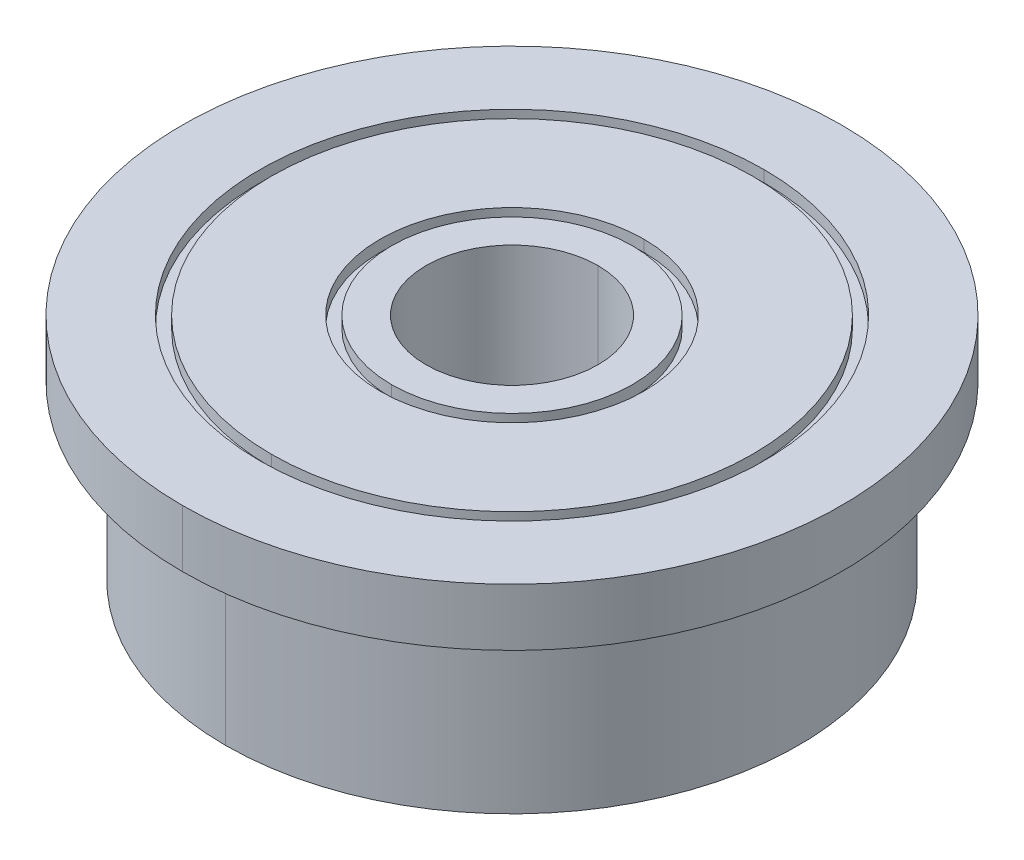
ISO-10303-21;
HEADER;
FILE_DESCRIPTION(('STEP AP214'),'2;1');
FILE_NAME('part.step','',(''),(''),'','','');
FILE_SCHEMA(('AUTOMOTIVE_DESIGN { 1 0 10303 214 1 1 1 1 }'));
ENDSEC;
DATA;
#1=APPLICATION_CONTEXT('core data for automotive mechanical design processes');
#2=APPLICATION_PROTOCOL_DEFINITION('international standard','automotive_design',2000,#1);
#3=PRODUCT_CONTEXT('',#1,'mechanical');
#4=PRODUCT('Part','Part','',(#3));
#5=PRODUCT_RELATED_PRODUCT_CATEGORY('part','',(#4));
#6=PRODUCT_DEFINITION_FORMATION('','',#4);
#7=PRODUCT_DEFINITION_CONTEXT('part definition',#1,'design');
#8=PRODUCT_DEFINITION('design','',#6,#7);
#9=PRODUCT_DEFINITION_SHAPE('','',#8);
#10=(LENGTH_UNIT() NAMED_UNIT(*) SI_UNIT(.MILLI.,.METRE.));
#11=(NAMED_UNIT(*) PLANE_ANGLE_UNIT() SI_UNIT($,.RADIAN.));
#12=(NAMED_UNIT(*) SI_UNIT($,.STERADIAN.) SOLID_ANGLE_UNIT());
#13=UNCERTAINTY_MEASURE_WITH_UNIT(LENGTH_MEASURE(1.E-05),#10,'distance_accuracy_value','');
#14=(GEOMETRIC_REPRESENTATION_CONTEXT(3) GLOBAL_UNCERTAINTY_ASSIGNED_CONTEXT((#13)) GLOBAL_UNIT_ASSIGNED_CONTEXT((#10,
#11,#12)) REPRESENTATION_CONTEXT('',''));
#15=CARTESIAN_POINT('',(0.,0.,0.));
#16=DIRECTION('',(0.,0.,1.));
#17=DIRECTION('',(1.,0.,0.));
#18=AXIS2_PLACEMENT_3D('',#15,#16,#17);
#19=CARTESIAN_POINT('',(0.,3.99999999999999,-5.75));
#20=DIRECTION('',(0.,1.,0.));
#21=DIRECTION('',(0.,0.,1.));
#22=AXIS2_PLACEMENT_3D('',#19,#20,#21);
#23=PLANE('',#22);
#24=CARTESIAN_POINT('',(0.,4.,0.));
#25=DIRECTION('',(0.,-1.,0.));
#26=DIRECTION('',(0.,0.,-1.));
#27=AXIS2_PLACEMENT_3D('',#24,#25,#26);
#28=CIRCLE('',#27,2.1);
#29=CARTESIAN_POINT('',(0.,4.,-2.1));
#30=VERTEX_POINT('',#29);
#31=CARTESIAN_POINT('',(0.,4.,2.1));
#32=VERTEX_POINT('',#31);
#33=EDGE_CURVE('E20',#30,#32,#28,.T.);
#34=ORIENTED_EDGE('',*,*,#33,.F.);
#35=CARTESIAN_POINT('',(0.,4.,0.));
#36=DIRECTION('',(0.,-1.,0.));
#37=DIRECTION('',(0.,0.,-1.));
#38=AXIS2_PLACEMENT_3D('',#35,#36,#37);
#39=CIRCLE('',#38,2.1);
#40=EDGE_CURVE('E171',#32,#30,#39,.T.);
#41=ORIENTED_EDGE('',*,*,#40,.F.);
#42=EDGE_LOOP('',(#34,#41));
#43=FACE_BOUND('',#42,.T.);
#44=CARTESIAN_POINT('',(0.,3.99999999999999,0.));
#45=DIRECTION('',(0.,1.,0.));
#46=DIRECTION('',(0.,0.,1.));
#47=AXIS2_PLACEMENT_3D('',#44,#45,#46);
#48=CIRCLE('',#47,1.5);
#49=CARTESIAN_POINT('',(0.,3.99999999999999,1.5));
#50=VERTEX_POINT('',#49);
#51=CARTESIAN_POINT('',(0.,3.99999999999999,-1.5));
#52=VERTEX_POINT('',#51);
#53=EDGE_CURVE('E299',#50,#52,#48,.F.);
#54=ORIENTED_EDGE('',*,*,#53,.T.);
#55=CARTESIAN_POINT('',(0.,3.99999999999999,0.));
#56=DIRECTION('',(0.,1.,0.));
#57=DIRECTION('',(0.,0.,1.));
#58=AXIS2_PLACEMENT_3D('',#55,#56,#57);
#59=CIRCLE('',#58,1.5);
#60=EDGE_CURVE('E302',#52,#50,#59,.F.);
#61=ORIENTED_EDGE('',*,*,#60,.T.);
#62=EDGE_LOOP('',(#54,#61));
#63=FACE_BOUND('',#62,.T.);
#64=ADVANCED_FACE('F17',(#43,#63),#23,.T.);
#65=CARTESIAN_POINT('',(0.,0.,0.));
#66=DIRECTION('',(0.,-1.,0.));
#67=DIRECTION('',(0.,0.,-1.));
#68=AXIS2_PLACEMENT_3D('',#65,#66,#67);
#69=CYLINDRICAL_SURFACE('',#68,2.1);
#70=CARTESIAN_POINT('',(0.,3.8,0.));
#71=DIRECTION('',(0.,-1.,0.));
#72=DIRECTION('',(0.,0.,-1.));
#73=AXIS2_PLACEMENT_3D('',#70,#71,#72);
#74=CIRCLE('',#73,2.1);
#75=CARTESIAN_POINT('',(0.,3.8,2.1));
#76=VERTEX_POINT('',#75);
#77=CARTESIAN_POINT('',(0.,3.8,-2.1));
#78=VERTEX_POINT('',#77);
#79=EDGE_CURVE('E296',#76,#78,#74,.F.);
#80=ORIENTED_EDGE('',*,*,#79,.T.);
#81=DIRECTION('',(0.,-1.,0.));
#82=VECTOR('',#81,1.);
#83=CARTESIAN_POINT('',(0.,0.,-2.1));
#84=LINE('',#83,#82);
#85=EDGE_CURVE('E169',#30,#78,#84,.T.);
#86=ORIENTED_EDGE('',*,*,#85,.F.);
#87=ORIENTED_EDGE('',*,*,#33,.T.);
#88=DIRECTION('',(0.,-1.,0.));
#89=VECTOR('',#88,1.);
#90=CARTESIAN_POINT('',(0.,0.,2.1));
#91=LINE('',#90,#89);
#92=EDGE_CURVE('E166',#76,#32,#91,.F.);
#93=ORIENTED_EDGE('',*,*,#92,.F.);
#94=EDGE_LOOP('',(#80,#86,#87,#93));
#95=FACE_BOUND('',#94,.T.);
#96=ADVANCED_FACE('F164',(#95),#69,.T.);
#97=CARTESIAN_POINT('',(0.,0.,0.));
#98=DIRECTION('',(0.,-1.,0.));
#99=DIRECTION('',(0.,0.,-1.));
#100=AXIS2_PLACEMENT_3D('',#97,#98,#99);
#101=CYLINDRICAL_SURFACE('',#100,2.1);
#102=ORIENTED_EDGE('',*,*,#85,.T.);
#103=CARTESIAN_POINT('',(0.,3.8,0.));
#104=DIRECTION('',(0.,-1.,0.));
#105=DIRECTION('',(0.,0.,-1.));
#106=AXIS2_PLACEMENT_3D('',#103,#104,#105);
#107=CIRCLE('',#106,2.1);
#108=EDGE_CURVE('E176',#78,#76,#107,.F.);
#109=ORIENTED_EDGE('',*,*,#108,.T.);
#110=ORIENTED_EDGE('',*,*,#92,.T.);
#111=ORIENTED_EDGE('',*,*,#40,.T.);
#112=EDGE_LOOP('',(#102,#109,#110,#111));
#113=FACE_BOUND('',#112,.T.);
#114=ADVANCED_FACE('F174',(#113),#101,.T.);
#115=CARTESIAN_POINT('',(0.,0.,0.));
#116=DIRECTION('',(0.,1.,0.));
#117=DIRECTION('',(0.,0.,1.));
#118=AXIS2_PLACEMENT_3D('',#115,#116,#117);
#119=CYLINDRICAL_SURFACE('',#118,1.5);
#120=CARTESIAN_POINT('',(0.,0.,0.));
#121=DIRECTION('',(0.,1.,0.));
#122=DIRECTION('',(0.,0.,1.));
#123=AXIS2_PLACEMENT_3D('',#120,#121,#122);
#124=CIRCLE('',#123,1.5);
#125=CARTESIAN_POINT('',(0.,0.,1.5));
#126=VERTEX_POINT('',#125);
#127=CARTESIAN_POINT('',(0.,0.,-1.5));
#128=VERTEX_POINT('',#127);
#129=EDGE_CURVE('E292',#126,#128,#124,.T.);
#130=ORIENTED_EDGE('',*,*,#129,.F.);
#131=DIRECTION('',(0.,1.,0.));
#132=VECTOR('',#131,1.);
#133=CARTESIAN_POINT('',(0.,0.,1.5));
#134=LINE('',#133,#132);
#135=EDGE_CURVE('E301',#126,#50,#134,.T.);
#136=ORIENTED_EDGE('',*,*,#135,.T.);
#137=ORIENTED_EDGE('',*,*,#60,.F.);
#138=DIRECTION('',(0.,1.,0.));
#139=VECTOR('',#138,1.);
#140=CARTESIAN_POINT('',(0.,0.,-1.5));
#141=LINE('',#140,#139);
#142=EDGE_CURVE('E298',#52,#128,#141,.F.);
#143=ORIENTED_EDGE('',*,*,#142,.T.);
#144=EDGE_LOOP('',(#130,#136,#137,#143));
#145=FACE_BOUND('',#144,.T.);
#146=ADVANCED_FACE('F320',(#145),#119,.F.);
#147=CARTESIAN_POINT('',(0.,0.,0.));
#148=DIRECTION('',(0.,1.,0.));
#149=DIRECTION('',(0.,0.,1.));
#150=AXIS2_PLACEMENT_3D('',#147,#148,#149);
#151=CYLINDRICAL_SURFACE('',#150,1.5);
#152=ORIENTED_EDGE('',*,*,#142,.F.);
#153=ORIENTED_EDGE('',*,*,#53,.F.);
#154=ORIENTED_EDGE('',*,*,#135,.F.);
#155=CARTESIAN_POINT('',(0.,0.,0.));
#156=DIRECTION('',(0.,1.,0.));
#157=DIRECTION('',(0.,0.,1.));
#158=AXIS2_PLACEMENT_3D('',#155,#156,#157);
#159=CIRCLE('',#158,1.5);
#160=EDGE_CURVE('E289',#128,#126,#159,.T.);
#161=ORIENTED_EDGE('',*,*,#160,.F.);
#162=EDGE_LOOP('',(#152,#153,#154,#161));
#163=FACE_BOUND('',#162,.T.);
#164=ADVANCED_FACE('F309',(#163),#151,.F.);
#165=CARTESIAN_POINT('',(0.,3.8,-2.1));
#166=DIRECTION('',(0.,-1.,0.));
#167=DIRECTION('',(0.,0.,-1.));
#168=AXIS2_PLACEMENT_3D('',#165,#166,#167);
#169=PLANE('',#168);
#170=CARTESIAN_POINT('',(0.,3.8,0.));
#171=DIRECTION('',(0.,-1.,0.));
#172=DIRECTION('',(0.,0.,-1.));
#173=AXIS2_PLACEMENT_3D('',#170,#171,#172);
#174=CIRCLE('',#173,2.3);
#175=CARTESIAN_POINT('',(0.,3.8,2.3));
#176=VERTEX_POINT('',#175);
#177=CARTESIAN_POINT('',(0.,3.8,-2.3));
#178=VERTEX_POINT('',#177);
#179=EDGE_CURVE('E287',#176,#178,#174,.F.);
#180=ORIENTED_EDGE('',*,*,#179,.T.);
#181=CARTESIAN_POINT('',(0.,3.8,0.));
#182=DIRECTION('',(0.,-1.,0.));
#183=DIRECTION('',(0.,0.,-1.));
#184=AXIS2_PLACEMENT_3D('',#181,#182,#183);
#185=CIRCLE('',#184,2.3);
#186=EDGE_CURVE('E284',#178,#176,#185,.F.);
#187=ORIENTED_EDGE('',*,*,#186,.T.);
#188=EDGE_LOOP('',(#180,#187));
#189=FACE_BOUND('',#188,.T.);
#190=ORIENTED_EDGE('',*,*,#79,.F.);
#191=ORIENTED_EDGE('',*,*,#108,.F.);
#192=EDGE_LOOP('',(#190,#191));
#193=FACE_BOUND('',#192,.T.);
#194=ADVANCED_FACE('F306',(#189,#193),#169,.F.);
#195=CARTESIAN_POINT('',(0.,0.,0.));
#196=DIRECTION('',(0.,-1.,0.));
#197=DIRECTION('',(0.,0.,-1.));
#198=AXIS2_PLACEMENT_3D('',#195,#196,#197);
#199=PLANE('',#198);
#200=CARTESIAN_POINT('',(0.,0.,0.));
#201=DIRECTION('',(0.,-1.,0.));
#202=DIRECTION('',(0.,0.,-1.));
#203=AXIS2_PLACEMENT_3D('',#200,#201,#202);
#204=CIRCLE('',#203,2.1);
#205=CARTESIAN_POINT('',(0.,0.,-2.1));
#206=VERTEX_POINT('',#205);
#207=CARTESIAN_POINT('',(0.,0.,2.1));
#208=VERTEX_POINT('',#207);
#209=EDGE_CURVE('E281',#206,#208,#204,.F.);
#210=ORIENTED_EDGE('',*,*,#209,.F.);
#211=CARTESIAN_POINT('',(0.,0.,0.));
#212=DIRECTION('',(0.,-1.,0.));
#213=DIRECTION('',(0.,0.,-1.));
#214=AXIS2_PLACEMENT_3D('',#211,#212,#213);
#215=CIRCLE('',#214,2.1);
#216=EDGE_CURVE('E277',#208,#206,#215,.F.);
#217=ORIENTED_EDGE('',*,*,#216,.F.);
#218=EDGE_LOOP('',(#210,#217));
#219=FACE_BOUND('',#218,.T.);
#220=ORIENTED_EDGE('',*,*,#129,.T.);
#221=ORIENTED_EDGE('',*,*,#160,.T.);
#222=EDGE_LOOP('',(#220,#221));
#223=FACE_BOUND('',#222,.T.);
#224=ADVANCED_FACE('F308',(#219,#223),#199,.T.);
#225=CARTESIAN_POINT('',(0.,0.,0.));
#226=DIRECTION('',(0.,-1.,0.));
#227=DIRECTION('',(0.,0.,-1.));
#228=AXIS2_PLACEMENT_3D('',#225,#226,#227);
#229=CYLINDRICAL_SURFACE('',#228,2.3);
#230=CARTESIAN_POINT('',(0.,4.,0.));
#231=DIRECTION('',(0.,-1.,0.));
#232=DIRECTION('',(0.,0.,-1.));
#233=AXIS2_PLACEMENT_3D('',#230,#231,#232);
#234=CIRCLE('',#233,2.3);
#235=CARTESIAN_POINT('',(0.,4.,-2.3));
#236=VERTEX_POINT('',#235);
#237=CARTESIAN_POINT('',(0.,4.,2.3));
#238=VERTEX_POINT('',#237);
#239=EDGE_CURVE('E273',#236,#238,#234,.T.);
#240=ORIENTED_EDGE('',*,*,#239,.F.);
#241=DIRECTION('',(0.,-1.,0.));
#242=VECTOR('',#241,1.);
#243=CARTESIAN_POINT('',(0.,0.,-2.3));
#244=LINE('',#243,#242);
#245=EDGE_CURVE('E286',#236,#178,#244,.T.);
#246=ORIENTED_EDGE('',*,*,#245,.T.);
#247=ORIENTED_EDGE('',*,*,#179,.F.);
#248=DIRECTION('',(0.,-1.,0.));
#249=VECTOR('',#248,1.);
#250=CARTESIAN_POINT('',(0.,0.,2.3));
#251=LINE('',#250,#249);
#252=EDGE_CURVE('E283',#176,#238,#251,.F.);
#253=ORIENTED_EDGE('',*,*,#252,.T.);
#254=EDGE_LOOP('',(#240,#246,#247,#253));
#255=FACE_BOUND('',#254,.T.);
#256=ADVANCED_FACE('F317',(#255),#229,.F.);
#257=CARTESIAN_POINT('',(0.,0.,0.));
#258=DIRECTION('',(0.,-1.,0.));
#259=DIRECTION('',(0.,0.,-1.));
#260=AXIS2_PLACEMENT_3D('',#257,#258,#259);
#261=CYLINDRICAL_SURFACE('',#260,2.3);
#262=ORIENTED_EDGE('',*,*,#252,.F.);
#263=ORIENTED_EDGE('',*,*,#186,.F.);
#264=ORIENTED_EDGE('',*,*,#245,.F.);
#265=CARTESIAN_POINT('',(0.,4.,0.));
#266=DIRECTION('',(0.,-1.,0.));
#267=DIRECTION('',(0.,0.,-1.));
#268=AXIS2_PLACEMENT_3D('',#265,#266,#267);
#269=CIRCLE('',#268,2.3);
#270=EDGE_CURVE('E270',#238,#236,#269,.T.);
#271=ORIENTED_EDGE('',*,*,#270,.F.);
#272=EDGE_LOOP('',(#262,#263,#264,#271));
#273=FACE_BOUND('',#272,.T.);
#274=ADVANCED_FACE('F421',(#273),#261,.F.);
#275=CARTESIAN_POINT('',(0.,0.,0.));
#276=DIRECTION('',(0.,-1.,0.));
#277=DIRECTION('',(0.,0.,-1.));
#278=AXIS2_PLACEMENT_3D('',#275,#276,#277);
#279=CYLINDRICAL_SURFACE('',#278,2.1);
#280=DIRECTION('',(0.,-1.,0.));
#281=VECTOR('',#280,1.);
#282=CARTESIAN_POINT('',(0.,0.,-2.1));
#283=LINE('',#282,#281);
#284=CARTESIAN_POINT('',(0.,0.2,-2.1));
#285=VERTEX_POINT('',#284);
#286=EDGE_CURVE('E276',#206,#285,#283,.F.);
#287=ORIENTED_EDGE('',*,*,#286,.F.);
#288=ORIENTED_EDGE('',*,*,#209,.T.);
#289=DIRECTION('',(0.,-1.,0.));
#290=VECTOR('',#289,1.);
#291=CARTESIAN_POINT('',(0.,0.,2.1));
#292=LINE('',#291,#290);
#293=CARTESIAN_POINT('',(0.,0.2,2.1));
#294=VERTEX_POINT('',#293);
#295=EDGE_CURVE('E280',#294,#208,#292,.T.);
#296=ORIENTED_EDGE('',*,*,#295,.F.);
#297=CARTESIAN_POINT('',(0.,0.2,0.));
#298=DIRECTION('',(0.,-1.,0.));
#299=DIRECTION('',(0.,0.,-1.));
#300=AXIS2_PLACEMENT_3D('',#297,#298,#299);
#301=CIRCLE('',#300,2.1);
#302=EDGE_CURVE('E268',#294,#285,#301,.T.);
#303=ORIENTED_EDGE('',*,*,#302,.T.);
#304=EDGE_LOOP('',(#287,#288,#296,#303));
#305=FACE_BOUND('',#304,.T.);
#306=ADVANCED_FACE('F417',(#305),#279,.T.);
#307=CARTESIAN_POINT('',(0.,0.,0.));
#308=DIRECTION('',(0.,-1.,0.));
#309=DIRECTION('',(0.,0.,-1.));
#310=AXIS2_PLACEMENT_3D('',#307,#308,#309);
#311=CYLINDRICAL_SURFACE('',#310,2.1);
#312=ORIENTED_EDGE('',*,*,#216,.T.);
#313=ORIENTED_EDGE('',*,*,#286,.T.);
#314=CARTESIAN_POINT('',(0.,0.2,0.));
#315=DIRECTION('',(0.,-1.,0.));
#316=DIRECTION('',(0.,0.,-1.));
#317=AXIS2_PLACEMENT_3D('',#314,#315,#316);
#318=CIRCLE('',#317,2.1);
#319=EDGE_CURVE('E265',#285,#294,#318,.T.);
#320=ORIENTED_EDGE('',*,*,#319,.T.);
#321=ORIENTED_EDGE('',*,*,#295,.T.);
#322=EDGE_LOOP('',(#312,#313,#320,#321));
#323=FACE_BOUND('',#322,.T.);
#324=ADVANCED_FACE('F413',(#323),#311,.T.);
#325=CARTESIAN_POINT('',(0.,3.99999999999999,-5.75));
#326=DIRECTION('',(0.,1.,0.));
#327=DIRECTION('',(0.,0.,1.));
#328=AXIS2_PLACEMENT_3D('',#325,#326,#327);
#329=PLANE('',#328);
#330=CARTESIAN_POINT('',(0.,4.,0.));
#331=DIRECTION('',(0.,-1.,0.));
#332=DIRECTION('',(0.,0.,-1.));
#333=AXIS2_PLACEMENT_3D('',#330,#331,#332);
#334=CIRCLE('',#333,4.2);
#335=CARTESIAN_POINT('',(0.,4.,-4.2));
#336=VERTEX_POINT('',#335);
#337=CARTESIAN_POINT('',(0.,4.,4.2));
#338=VERTEX_POINT('',#337);
#339=EDGE_CURVE('E263',#336,#338,#334,.T.);
#340=ORIENTED_EDGE('',*,*,#339,.F.);
#341=CARTESIAN_POINT('',(0.,4.,0.));
#342=DIRECTION('',(0.,-1.,0.));
#343=DIRECTION('',(0.,0.,-1.));
#344=AXIS2_PLACEMENT_3D('',#341,#342,#343);
#345=CIRCLE('',#344,4.2);
#346=EDGE_CURVE('E259',#338,#336,#345,.T.);
#347=ORIENTED_EDGE('',*,*,#346,.F.);
#348=EDGE_LOOP('',(#340,#347));
#349=FACE_BOUND('',#348,.T.);
#350=ORIENTED_EDGE('',*,*,#239,.T.);
#351=ORIENTED_EDGE('',*,*,#270,.T.);
#352=EDGE_LOOP('',(#350,#351));
#353=FACE_BOUND('',#352,.T.);
#354=ADVANCED_FACE('F409',(#349,#353),#329,.T.);
#355=CARTESIAN_POINT('',(0.,0.2,-2.1));
#356=DIRECTION('',(0.,1.,0.));
#357=DIRECTION('',(0.,0.,1.));
#358=AXIS2_PLACEMENT_3D('',#355,#356,#357);
#359=PLANE('',#358);
#360=ORIENTED_EDGE('',*,*,#302,.F.);
#361=ORIENTED_EDGE('',*,*,#319,.F.);
#362=EDGE_LOOP('',(#360,#361));
#363=FACE_BOUND('',#362,.T.);
#364=CARTESIAN_POINT('',(0.,0.2,0.));
#365=DIRECTION('',(0.,-1.,0.));
#366=DIRECTION('',(0.,0.,-1.));
#367=AXIS2_PLACEMENT_3D('',#364,#365,#366);
#368=CIRCLE('',#367,2.3);
#369=CARTESIAN_POINT('',(0.,0.2,2.3));
#370=VERTEX_POINT('',#369);
#371=CARTESIAN_POINT('',(0.,0.2,-2.3));
#372=VERTEX_POINT('',#371);
#373=EDGE_CURVE('E256',#370,#372,#368,.T.);
#374=ORIENTED_EDGE('',*,*,#373,.T.);
#375=CARTESIAN_POINT('',(0.,0.2,0.));
#376=DIRECTION('',(0.,-1.,0.));
#377=DIRECTION('',(0.,0.,-1.));
#378=AXIS2_PLACEMENT_3D('',#375,#376,#377);
#379=CIRCLE('',#378,2.3);
#380=EDGE_CURVE('E253',#372,#370,#379,.T.);
#381=ORIENTED_EDGE('',*,*,#380,.T.);
#382=EDGE_LOOP('',(#374,#381));
#383=FACE_BOUND('',#382,.T.);
#384=ADVANCED_FACE('F405',(#363,#383),#359,.F.);
#385=CARTESIAN_POINT('',(0.,0.,0.));
#386=DIRECTION('',(0.,-1.,0.));
#387=DIRECTION('',(0.,0.,-1.));
#388=AXIS2_PLACEMENT_3D('',#385,#386,#387);
#389=CYLINDRICAL_SURFACE('',#388,4.2);
#390=CARTESIAN_POINT('',(0.,3.8,0.));
#391=DIRECTION('',(0.,-1.,0.));
#392=DIRECTION('',(0.,0.,-1.));
#393=AXIS2_PLACEMENT_3D('',#390,#391,#392);
#394=CIRCLE('',#393,4.2);
#395=CARTESIAN_POINT('',(0.,3.8,4.2));
#396=VERTEX_POINT('',#395);
#397=CARTESIAN_POINT('',(0.,3.8,-4.2));
#398=VERTEX_POINT('',#397);
#399=EDGE_CURVE('E250',#396,#398,#394,.F.);
#400=ORIENTED_EDGE('',*,*,#399,.T.);
#401=DIRECTION('',(0.,-1.,0.));
#402=VECTOR('',#401,1.);
#403=CARTESIAN_POINT('',(0.,0.,-4.2));
#404=LINE('',#403,#402);
#405=EDGE_CURVE('E258',#336,#398,#404,.T.);
#406=ORIENTED_EDGE('',*,*,#405,.F.);
#407=ORIENTED_EDGE('',*,*,#339,.T.);
#408=DIRECTION('',(0.,-1.,0.));
#409=VECTOR('',#408,1.);
#410=CARTESIAN_POINT('',(0.,0.,4.2));
#411=LINE('',#410,#409);
#412=EDGE_CURVE('E262',#396,#338,#411,.F.);
#413=ORIENTED_EDGE('',*,*,#412,.F.);
#414=EDGE_LOOP('',(#400,#406,#407,#413));
#415=FACE_BOUND('',#414,.T.);
#416=ADVANCED_FACE('F401',(#415),#389,.T.);
#417=CARTESIAN_POINT('',(0.,0.,0.));
#418=DIRECTION('',(0.,-1.,0.));
#419=DIRECTION('',(0.,0.,-1.));
#420=AXIS2_PLACEMENT_3D('',#417,#418,#419);
#421=CYLINDRICAL_SURFACE('',#420,4.2);
#422=ORIENTED_EDGE('',*,*,#405,.T.);
#423=CARTESIAN_POINT('',(0.,3.8,0.));
#424=DIRECTION('',(0.,-1.,0.));
#425=DIRECTION('',(0.,0.,-1.));
#426=AXIS2_PLACEMENT_3D('',#423,#424,#425);
#427=CIRCLE('',#426,4.2);
#428=EDGE_CURVE('E247',#398,#396,#427,.F.);
#429=ORIENTED_EDGE('',*,*,#428,.T.);
#430=ORIENTED_EDGE('',*,*,#412,.T.);
#431=ORIENTED_EDGE('',*,*,#346,.T.);
#432=EDGE_LOOP('',(#422,#429,#430,#431));
#433=FACE_BOUND('',#432,.T.);
#434=ADVANCED_FACE('F397',(#433),#421,.T.);
#435=CARTESIAN_POINT('',(0.,0.,0.));
#436=DIRECTION('',(0.,-1.,0.));
#437=DIRECTION('',(0.,0.,-1.));
#438=AXIS2_PLACEMENT_3D('',#435,#436,#437);
#439=CYLINDRICAL_SURFACE('',#438,2.3);
#440=DIRECTION('',(0.,-1.,0.));
#441=VECTOR('',#440,1.);
#442=CARTESIAN_POINT('',(0.,0.,2.3));
#443=LINE('',#442,#441);
#444=CARTESIAN_POINT('',(0.,0.,2.3));
#445=VERTEX_POINT('',#444);
#446=EDGE_CURVE('E252',#370,#445,#443,.T.);
#447=ORIENTED_EDGE('',*,*,#446,.T.);
#448=CARTESIAN_POINT('',(0.,0.,0.));
#449=DIRECTION('',(0.,-1.,0.));
#450=DIRECTION('',(0.,0.,-1.));
#451=AXIS2_PLACEMENT_3D('',#448,#449,#450);
#452=CIRCLE('',#451,2.3);
#453=CARTESIAN_POINT('',(0.,0.,-2.3));
#454=VERTEX_POINT('',#453);
#455=EDGE_CURVE('E244',#454,#445,#452,.F.);
#456=ORIENTED_EDGE('',*,*,#455,.F.);
#457=DIRECTION('',(0.,-1.,0.));
#458=VECTOR('',#457,1.);
#459=CARTESIAN_POINT('',(0.,0.,-2.3));
#460=LINE('',#459,#458);
#461=EDGE_CURVE('E255',#454,#372,#460,.F.);
#462=ORIENTED_EDGE('',*,*,#461,.T.);
#463=ORIENTED_EDGE('',*,*,#373,.F.);
#464=EDGE_LOOP('',(#447,#456,#462,#463));
#465=FACE_BOUND('',#464,.T.);
#466=ADVANCED_FACE('F393',(#465),#439,.F.);
#467=CARTESIAN_POINT('',(0.,0.,0.));
#468=DIRECTION('',(0.,-1.,0.));
#469=DIRECTION('',(0.,0.,-1.));
#470=AXIS2_PLACEMENT_3D('',#467,#468,#469);
#471=CYLINDRICAL_SURFACE('',#470,2.3);
#472=ORIENTED_EDGE('',*,*,#380,.F.);
#473=ORIENTED_EDGE('',*,*,#461,.F.);
#474=CARTESIAN_POINT('',(0.,0.,0.));
#475=DIRECTION('',(0.,-1.,0.));
#476=DIRECTION('',(0.,0.,-1.));
#477=AXIS2_PLACEMENT_3D('',#474,#475,#476);
#478=CIRCLE('',#477,2.3);
#479=EDGE_CURVE('E241',#445,#454,#478,.F.);
#480=ORIENTED_EDGE('',*,*,#479,.F.);
#481=ORIENTED_EDGE('',*,*,#446,.F.);
#482=EDGE_LOOP('',(#472,#473,#480,#481));
#483=FACE_BOUND('',#482,.T.);
#484=ADVANCED_FACE('F389',(#483),#471,.F.);
#485=CARTESIAN_POINT('',(0.,3.8,-4.2));
#486=DIRECTION('',(0.,-1.,0.));
#487=DIRECTION('',(0.,0.,-1.));
#488=AXIS2_PLACEMENT_3D('',#485,#486,#487);
#489=PLANE('',#488);
#490=CARTESIAN_POINT('',(0.,3.8,0.));
#491=DIRECTION('',(0.,-1.,0.));
#492=DIRECTION('',(0.,0.,-1.));
#493=AXIS2_PLACEMENT_3D('',#490,#491,#492);
#494=CIRCLE('',#493,4.4);
#495=CARTESIAN_POINT('',(0.,3.8,4.4));
#496=VERTEX_POINT('',#495);
#497=CARTESIAN_POINT('',(0.,3.8,-4.4));
#498=VERTEX_POINT('',#497);
#499=EDGE_CURVE('E239',#496,#498,#494,.F.);
#500=ORIENTED_EDGE('',*,*,#499,.T.);
#501=CARTESIAN_POINT('',(0.,3.8,0.));
#502=DIRECTION('',(0.,-1.,0.));
#503=DIRECTION('',(0.,0.,-1.));
#504=AXIS2_PLACEMENT_3D('',#501,#502,#503);
#505=CIRCLE('',#504,4.4);
#506=EDGE_CURVE('E236',#498,#496,#505,.F.);
#507=ORIENTED_EDGE('',*,*,#506,.T.);
#508=EDGE_LOOP('',(#500,#507));
#509=FACE_BOUND('',#508,.T.);
#510=ORIENTED_EDGE('',*,*,#399,.F.);
#511=ORIENTED_EDGE('',*,*,#428,.F.);
#512=EDGE_LOOP('',(#510,#511));
#513=FACE_BOUND('',#512,.T.);
#514=ADVANCED_FACE('F385',(#509,#513),#489,.F.);
#515=CARTESIAN_POINT('',(0.,0.,0.));
#516=DIRECTION('',(0.,-1.,0.));
#517=DIRECTION('',(0.,0.,-1.));
#518=AXIS2_PLACEMENT_3D('',#515,#516,#517);
#519=PLANE('',#518);
#520=ORIENTED_EDGE('',*,*,#455,.T.);
#521=ORIENTED_EDGE('',*,*,#479,.T.);
#522=EDGE_LOOP('',(#520,#521));
#523=FACE_BOUND('',#522,.T.);
#524=CARTESIAN_POINT('',(0.,0.,0.));
#525=DIRECTION('',(0.,-1.,0.));
#526=DIRECTION('',(0.,0.,-1.));
#527=AXIS2_PLACEMENT_3D('',#524,#525,#526);
#528=CIRCLE('',#527,4.2);
#529=CARTESIAN_POINT('',(0.,0.,-4.2));
#530=VERTEX_POINT('',#529);
#531=CARTESIAN_POINT('',(0.,0.,4.2));
#532=VERTEX_POINT('',#531);
#533=EDGE_CURVE('E233',#530,#532,#528,.F.);
#534=ORIENTED_EDGE('',*,*,#533,.F.);
#535=CARTESIAN_POINT('',(0.,0.,0.));
#536=DIRECTION('',(0.,-1.,0.));
#537=DIRECTION('',(0.,0.,-1.));
#538=AXIS2_PLACEMENT_3D('',#535,#536,#537);
#539=CIRCLE('',#538,4.2);
#540=EDGE_CURVE('E229',#532,#530,#539,.F.);
#541=ORIENTED_EDGE('',*,*,#540,.F.);
#542=EDGE_LOOP('',(#534,#541));
#543=FACE_BOUND('',#542,.T.);
#544=ADVANCED_FACE('F381',(#523,#543),#519,.T.);
#545=CARTESIAN_POINT('',(0.,0.,0.));
#546=DIRECTION('',(0.,-1.,0.));
#547=DIRECTION('',(0.,0.,-1.));
#548=AXIS2_PLACEMENT_3D('',#545,#546,#547);
#549=CYLINDRICAL_SURFACE('',#548,4.4);
#550=CARTESIAN_POINT('',(0.,4.,0.));
#551=DIRECTION('',(0.,-1.,0.));
#552=DIRECTION('',(0.,0.,-1.));
#553=AXIS2_PLACEMENT_3D('',#550,#551,#552);
#554=CIRCLE('',#553,4.4);
#555=CARTESIAN_POINT('',(0.,4.,-4.4));
#556=VERTEX_POINT('',#555);
#557=CARTESIAN_POINT('',(0.,4.,4.4));
#558=VERTEX_POINT('',#557);
#559=EDGE_CURVE('E225',#556,#558,#554,.T.);
#560=ORIENTED_EDGE('',*,*,#559,.F.);
#561=DIRECTION('',(0.,-1.,0.));
#562=VECTOR('',#561,1.);
#563=CARTESIAN_POINT('',(0.,0.,-4.4));
#564=LINE('',#563,#562);
#565=EDGE_CURVE('E238',#556,#498,#564,.T.);
#566=ORIENTED_EDGE('',*,*,#565,.T.);
#567=ORIENTED_EDGE('',*,*,#499,.F.);
#568=DIRECTION('',(0.,-1.,0.));
#569=VECTOR('',#568,1.);
#570=CARTESIAN_POINT('',(0.,0.,4.4));
#571=LINE('',#570,#569);
#572=EDGE_CURVE('E235',#496,#558,#571,.F.);
#573=ORIENTED_EDGE('',*,*,#572,.T.);
#574=EDGE_LOOP('',(#560,#566,#567,#573));
#575=FACE_BOUND('',#574,.T.);
#576=ADVANCED_FACE('F377',(#575),#549,.F.);
#577=CARTESIAN_POINT('',(0.,0.,0.));
#578=DIRECTION('',(0.,-1.,0.));
#579=DIRECTION('',(0.,0.,-1.));
#580=AXIS2_PLACEMENT_3D('',#577,#578,#579);
#581=CYLINDRICAL_SURFACE('',#580,4.4);
#582=ORIENTED_EDGE('',*,*,#572,.F.);
#583=ORIENTED_EDGE('',*,*,#506,.F.);
#584=ORIENTED_EDGE('',*,*,#565,.F.);
#585=CARTESIAN_POINT('',(0.,4.,0.));
#586=DIRECTION('',(0.,-1.,0.));
#587=DIRECTION('',(0.,0.,-1.));
#588=AXIS2_PLACEMENT_3D('',#585,#586,#587);
#589=CIRCLE('',#588,4.4);
#590=EDGE_CURVE('E222',#558,#556,#589,.T.);
#591=ORIENTED_EDGE('',*,*,#590,.F.);
#592=EDGE_LOOP('',(#582,#583,#584,#591));
#593=FACE_BOUND('',#592,.T.);
#594=ADVANCED_FACE('F373',(#593),#581,.F.);
#595=CARTESIAN_POINT('',(0.,0.,0.));
#596=DIRECTION('',(0.,-1.,0.));
#597=DIRECTION('',(0.,0.,-1.));
#598=AXIS2_PLACEMENT_3D('',#595,#596,#597);
#599=CYLINDRICAL_SURFACE('',#598,4.2);
#600=DIRECTION('',(0.,-1.,0.));
#601=VECTOR('',#600,1.);
#602=CARTESIAN_POINT('',(0.,0.,-4.2));
#603=LINE('',#602,#601);
#604=CARTESIAN_POINT('',(0.,0.2,-4.2));
#605=VERTEX_POINT('',#604);
#606=EDGE_CURVE('E228',#530,#605,#603,.F.);
#607=ORIENTED_EDGE('',*,*,#606,.F.);
#608=ORIENTED_EDGE('',*,*,#533,.T.);
#609=DIRECTION('',(0.,-1.,0.));
#610=VECTOR('',#609,1.);
#611=CARTESIAN_POINT('',(0.,0.,4.2));
#612=LINE('',#611,#610);
#613=CARTESIAN_POINT('',(0.,0.2,4.2));
#614=VERTEX_POINT('',#613);
#615=EDGE_CURVE('E232',#614,#532,#612,.T.);
#616=ORIENTED_EDGE('',*,*,#615,.F.);
#617=CARTESIAN_POINT('',(0.,0.2,0.));
#618=DIRECTION('',(0.,-1.,0.));
#619=DIRECTION('',(0.,0.,-1.));
#620=AXIS2_PLACEMENT_3D('',#617,#618,#619);
#621=CIRCLE('',#620,4.2);
#622=EDGE_CURVE('E220',#614,#605,#621,.T.);
#623=ORIENTED_EDGE('',*,*,#622,.T.);
#624=EDGE_LOOP('',(#607,#608,#616,#623));
#625=FACE_BOUND('',#624,.T.);
#626=ADVANCED_FACE('F369',(#625),#599,.T.);
#627=CARTESIAN_POINT('',(0.,0.,0.));
#628=DIRECTION('',(0.,-1.,0.));
#629=DIRECTION('',(0.,0.,-1.));
#630=AXIS2_PLACEMENT_3D('',#627,#628,#629);
#631=CYLINDRICAL_SURFACE('',#630,4.2);
#632=ORIENTED_EDGE('',*,*,#540,.T.);
#633=ORIENTED_EDGE('',*,*,#606,.T.);
#634=CARTESIAN_POINT('',(0.,0.2,0.));
#635=DIRECTION('',(0.,-1.,0.));
#636=DIRECTION('',(0.,0.,-1.));
#637=AXIS2_PLACEMENT_3D('',#634,#635,#636);
#638=CIRCLE('',#637,4.2);
#639=EDGE_CURVE('E217',#605,#614,#638,.T.);
#640=ORIENTED_EDGE('',*,*,#639,.T.);
#641=ORIENTED_EDGE('',*,*,#615,.T.);
#642=EDGE_LOOP('',(#632,#633,#640,#641));
#643=FACE_BOUND('',#642,.T.);
#644=ADVANCED_FACE('F365',(#643),#631,.T.);
#645=CARTESIAN_POINT('',(0.,3.99999999999999,-5.75));
#646=DIRECTION('',(0.,1.,0.));
#647=DIRECTION('',(0.,0.,1.));
#648=AXIS2_PLACEMENT_3D('',#645,#646,#647);
#649=PLANE('',#648);
#650=ORIENTED_EDGE('',*,*,#559,.T.);
#651=ORIENTED_EDGE('',*,*,#590,.T.);
#652=EDGE_LOOP('',(#650,#651));
#653=FACE_BOUND('',#652,.T.);
#654=CARTESIAN_POINT('',(0.,4.,0.));
#655=DIRECTION('',(0.,-1.,0.));
#656=DIRECTION('',(0.,0.,-1.));
#657=AXIS2_PLACEMENT_3D('',#654,#655,#656);
#658=CIRCLE('',#657,5.75);
#659=CARTESIAN_POINT('',(0.,4.,-5.75));
#660=VERTEX_POINT('',#659);
#661=CARTESIAN_POINT('',(0.,4.,5.75));
#662=VERTEX_POINT('',#661);
#663=EDGE_CURVE('E215',#660,#662,#658,.T.);
#664=ORIENTED_EDGE('',*,*,#663,.F.);
#665=CARTESIAN_POINT('',(0.,4.,0.));
#666=DIRECTION('',(0.,-1.,0.));
#667=DIRECTION('',(0.,0.,-1.));
#668=AXIS2_PLACEMENT_3D('',#665,#666,#667);
#669=CIRCLE('',#668,5.75);
#670=EDGE_CURVE('E211',#662,#660,#669,.T.);
#671=ORIENTED_EDGE('',*,*,#670,.F.);
#672=EDGE_LOOP('',(#664,#671));
#673=FACE_BOUND('',#672,.T.);
#674=ADVANCED_FACE('F361',(#653,#673),#649,.T.);
#675=CARTESIAN_POINT('',(0.,0.2,-4.2));
#676=DIRECTION('',(0.,1.,0.));
#677=DIRECTION('',(0.,0.,1.));
#678=AXIS2_PLACEMENT_3D('',#675,#676,#677);
#679=PLANE('',#678);
#680=ORIENTED_EDGE('',*,*,#622,.F.);
#681=ORIENTED_EDGE('',*,*,#639,.F.);
#682=EDGE_LOOP('',(#680,#681));
#683=FACE_BOUND('',#682,.T.);
#684=CARTESIAN_POINT('',(0.,0.2,0.));
#685=DIRECTION('',(0.,-1.,0.));
#686=DIRECTION('',(0.,0.,-1.));
#687=AXIS2_PLACEMENT_3D('',#684,#685,#686);
#688=CIRCLE('',#687,4.4);
#689=CARTESIAN_POINT('',(0.,0.2,4.4));
#690=VERTEX_POINT('',#689);
#691=CARTESIAN_POINT('',(0.,0.2,-4.4));
#692=VERTEX_POINT('',#691);
#693=EDGE_CURVE('E208',#690,#692,#688,.T.);
#694=ORIENTED_EDGE('',*,*,#693,.T.);
#695=CARTESIAN_POINT('',(0.,0.2,0.));
#696=DIRECTION('',(0.,-1.,0.));
#697=DIRECTION('',(0.,0.,-1.));
#698=AXIS2_PLACEMENT_3D('',#695,#696,#697);
#699=CIRCLE('',#698,4.4);
#700=EDGE_CURVE('E205',#692,#690,#699,.T.);
#701=ORIENTED_EDGE('',*,*,#700,.T.);
#702=EDGE_LOOP('',(#694,#701));
#703=FACE_BOUND('',#702,.T.);
#704=ADVANCED_FACE('F357',(#683,#703),#679,.F.);
#705=CARTESIAN_POINT('',(0.,0.,0.));
#706=DIRECTION('',(0.,-1.,0.));
#707=DIRECTION('',(0.,0.,-1.));
#708=AXIS2_PLACEMENT_3D('',#705,#706,#707);
#709=CYLINDRICAL_SURFACE('',#708,5.75);
#710=CARTESIAN_POINT('',(0.,3.,0.));
#711=DIRECTION('',(0.,-1.,0.));
#712=DIRECTION('',(0.,0.,-1.));
#713=AXIS2_PLACEMENT_3D('',#710,#711,#712);
#714=CIRCLE('',#713,5.75);
#715=CARTESIAN_POINT('',(0.,3.,-5.75));
#716=VERTEX_POINT('',#715);
#717=CARTESIAN_POINT('',(0.,3.,5.75));
#718=VERTEX_POINT('',#717);
#719=EDGE_CURVE('E201',#716,#718,#714,.T.);
#720=ORIENTED_EDGE('',*,*,#719,.F.);
#721=DIRECTION('',(0.,-1.,0.));
#722=VECTOR('',#721,1.);
#723=CARTESIAN_POINT('',(0.,0.,-5.75));
#724=LINE('',#723,#722);
#725=EDGE_CURVE('E210',#660,#716,#724,.T.);
#726=ORIENTED_EDGE('',*,*,#725,.F.);
#727=ORIENTED_EDGE('',*,*,#663,.T.);
#728=DIRECTION('',(0.,-1.,0.));
#729=VECTOR('',#728,1.);
#730=CARTESIAN_POINT('',(0.,0.,5.75));
#731=LINE('',#730,#729);
#732=EDGE_CURVE('E214',#718,#662,#731,.F.);
#733=ORIENTED_EDGE('',*,*,#732,.F.);
#734=EDGE_LOOP('',(#720,#726,#727,#733));
#735=FACE_BOUND('',#734,.T.);
#736=ADVANCED_FACE('F353',(#735),#709,.T.);
#737=CARTESIAN_POINT('',(0.,0.,0.));
#738=DIRECTION('',(0.,-1.,0.));
#739=DIRECTION('',(0.,0.,-1.));
#740=AXIS2_PLACEMENT_3D('',#737,#738,#739);
#741=CYLINDRICAL_SURFACE('',#740,5.75);
#742=ORIENTED_EDGE('',*,*,#725,.T.);
#743=CARTESIAN_POINT('',(0.,3.,0.));
#744=DIRECTION('',(0.,-1.,0.));
#745=DIRECTION('',(0.,0.,-1.));
#746=AXIS2_PLACEMENT_3D('',#743,#744,#745);
#747=CIRCLE('',#746,5.75);
#748=EDGE_CURVE('E198',#718,#716,#747,.T.);
#749=ORIENTED_EDGE('',*,*,#748,.F.);
#750=ORIENTED_EDGE('',*,*,#732,.T.);
#751=ORIENTED_EDGE('',*,*,#670,.T.);
#752=EDGE_LOOP('',(#742,#749,#750,#751));
#753=FACE_BOUND('',#752,.T.);
#754=ADVANCED_FACE('F349',(#753),#741,.T.);
#755=CARTESIAN_POINT('',(0.,0.,0.));
#756=DIRECTION('',(0.,-1.,0.));
#757=DIRECTION('',(0.,0.,-1.));
#758=AXIS2_PLACEMENT_3D('',#755,#756,#757);
#759=CYLINDRICAL_SURFACE('',#758,4.4);
#760=DIRECTION('',(0.,-1.,0.));
#761=VECTOR('',#760,1.);
#762=CARTESIAN_POINT('',(0.,0.,4.4));
#763=LINE('',#762,#761);
#764=CARTESIAN_POINT('',(0.,0.,4.4));
#765=VERTEX_POINT('',#764);
#766=EDGE_CURVE('E204',#690,#765,#763,.T.);
#767=ORIENTED_EDGE('',*,*,#766,.T.);
#768=CARTESIAN_POINT('',(0.,0.,0.));
#769=DIRECTION('',(0.,-1.,0.));
#770=DIRECTION('',(0.,0.,-1.));
#771=AXIS2_PLACEMENT_3D('',#768,#769,#770);
#772=CIRCLE('',#771,4.4);
#773=CARTESIAN_POINT('',(0.,0.,-4.4));
#774=VERTEX_POINT('',#773);
#775=EDGE_CURVE('E195',#774,#765,#772,.F.);
#776=ORIENTED_EDGE('',*,*,#775,.F.);
#777=DIRECTION('',(0.,-1.,0.));
#778=VECTOR('',#777,1.);
#779=CARTESIAN_POINT('',(0.,0.,-4.4));
#780=LINE('',#779,#778);
#781=EDGE_CURVE('E207',#774,#692,#780,.F.);
#782=ORIENTED_EDGE('',*,*,#781,.T.);
#783=ORIENTED_EDGE('',*,*,#693,.F.);
#784=EDGE_LOOP('',(#767,#776,#782,#783));
#785=FACE_BOUND('',#784,.T.);
#786=ADVANCED_FACE('F345',(#785),#759,.F.);
#787=CARTESIAN_POINT('',(0.,0.,0.));
#788=DIRECTION('',(0.,-1.,0.));
#789=DIRECTION('',(0.,0.,-1.));
#790=AXIS2_PLACEMENT_3D('',#787,#788,#789);
#791=CYLINDRICAL_SURFACE('',#790,4.4);
#792=ORIENTED_EDGE('',*,*,#700,.F.);
#793=ORIENTED_EDGE('',*,*,#781,.F.);
#794=CARTESIAN_POINT('',(0.,0.,0.));
#795=DIRECTION('',(0.,-1.,0.));
#796=DIRECTION('',(0.,0.,-1.));
#797=AXIS2_PLACEMENT_3D('',#794,#795,#796);
#798=CIRCLE('',#797,4.4);
#799=EDGE_CURVE('E192',#765,#774,#798,.F.);
#800=ORIENTED_EDGE('',*,*,#799,.F.);
#801=ORIENTED_EDGE('',*,*,#766,.F.);
#802=EDGE_LOOP('',(#792,#793,#800,#801));
#803=FACE_BOUND('',#802,.T.);
#804=ADVANCED_FACE('F341',(#803),#791,.F.);
#805=CARTESIAN_POINT('',(0.,3.,-5.));
#806=DIRECTION('',(0.,-1.,0.));
#807=DIRECTION('',(0.,0.,-1.));
#808=AXIS2_PLACEMENT_3D('',#805,#806,#807);
#809=PLANE('',#808);
#810=ORIENTED_EDGE('',*,*,#719,.T.);
#811=ORIENTED_EDGE('',*,*,#748,.T.);
#812=EDGE_LOOP('',(#810,#811));
#813=FACE_BOUND('',#812,.T.);
#814=CARTESIAN_POINT('',(0.,3.,0.));
#815=DIRECTION('',(0.,-1.,0.));
#816=DIRECTION('',(0.,0.,-1.));
#817=AXIS2_PLACEMENT_3D('',#814,#815,#816);
#818=CIRCLE('',#817,5.);
#819=CARTESIAN_POINT('',(0.,3.,-5.));
#820=VERTEX_POINT('',#819);
#821=CARTESIAN_POINT('',(0.,3.,5.));
#822=VERTEX_POINT('',#821);
#823=EDGE_CURVE('E185',#820,#822,#818,.T.);
#824=ORIENTED_EDGE('',*,*,#823,.F.);
#825=CARTESIAN_POINT('',(0.,3.,0.));
#826=DIRECTION('',(0.,-1.,0.));
#827=DIRECTION('',(0.,0.,-1.));
#828=AXIS2_PLACEMENT_3D('',#825,#826,#827);
#829=CIRCLE('',#828,5.);
#830=EDGE_CURVE('E189',#822,#820,#829,.T.);
#831=ORIENTED_EDGE('',*,*,#830,.F.);
#832=EDGE_LOOP('',(#824,#831));
#833=FACE_BOUND('',#832,.T.);
#834=ADVANCED_FACE('F337',(#813,#833),#809,.T.);
#835=CARTESIAN_POINT('',(0.,0.,0.));
#836=DIRECTION('',(0.,-1.,0.));
#837=DIRECTION('',(0.,0.,-1.));
#838=AXIS2_PLACEMENT_3D('',#835,#836,#837);
#839=PLANE('',#838);
#840=ORIENTED_EDGE('',*,*,#775,.T.);
#841=ORIENTED_EDGE('',*,*,#799,.T.);
#842=EDGE_LOOP('',(#840,#841));
#843=FACE_BOUND('',#842,.T.);
#844=CARTESIAN_POINT('',(0.,0.,0.));
#845=DIRECTION('',(0.,-1.,0.));
#846=DIRECTION('',(0.,0.,-1.));
#847=AXIS2_PLACEMENT_3D('',#844,#845,#846);
#848=CIRCLE('',#847,5.);
#849=CARTESIAN_POINT('',(0.,0.,-5.));
#850=VERTEX_POINT('',#849);
#851=CARTESIAN_POINT('',(0.,0.,5.));
#852=VERTEX_POINT('',#851);
#853=EDGE_CURVE('E34',#850,#852,#848,.F.);
#854=ORIENTED_EDGE('',*,*,#853,.F.);
#855=CARTESIAN_POINT('',(0.,0.,0.));
#856=DIRECTION('',(0.,-1.,0.));
#857=DIRECTION('',(0.,0.,-1.));
#858=AXIS2_PLACEMENT_3D('',#855,#856,#857);
#859=CIRCLE('',#858,5.);
#860=EDGE_CURVE('E26',#852,#850,#859,.F.);
#861=ORIENTED_EDGE('',*,*,#860,.F.);
#862=EDGE_LOOP('',(#854,#861));
#863=FACE_BOUND('',#862,.T.);
#864=ADVANCED_FACE('F331',(#843,#863),#839,.T.);
#865=CARTESIAN_POINT('',(0.,0.,0.));
#866=DIRECTION('',(0.,-1.,0.));
#867=DIRECTION('',(0.,0.,-1.));
#868=AXIS2_PLACEMENT_3D('',#865,#866,#867);
#869=CYLINDRICAL_SURFACE('',#868,5.);
#870=DIRECTION('',(0.,-1.,0.));
#871=VECTOR('',#870,1.);
#872=CARTESIAN_POINT('',(0.,0.,-5.));
#873=LINE('',#872,#871);
#874=EDGE_CURVE('E11',#850,#820,#873,.F.);
#875=ORIENTED_EDGE('',*,*,#874,.F.);
#876=ORIENTED_EDGE('',*,*,#853,.T.);
#877=DIRECTION('',(0.,-1.,0.));
#878=VECTOR('',#877,1.);
#879=CARTESIAN_POINT('',(0.,0.,5.));
#880=LINE('',#879,#878);
#881=EDGE_CURVE('E184',#822,#852,#880,.T.);
#882=ORIENTED_EDGE('',*,*,#881,.F.);
#883=ORIENTED_EDGE('',*,*,#830,.T.);
#884=EDGE_LOOP('',(#875,#876,#882,#883));
#885=FACE_BOUND('',#884,.T.);
#886=ADVANCED_FACE('F325',(#885),#869,.T.);
#887=CARTESIAN_POINT('',(0.,0.,0.));
#888=DIRECTION('',(0.,-1.,0.));
#889=DIRECTION('',(0.,0.,-1.));
#890=AXIS2_PLACEMENT_3D('',#887,#888,#889);
#891=CYLINDRICAL_SURFACE('',#890,5.);
#892=ORIENTED_EDGE('',*,*,#860,.T.);
#893=ORIENTED_EDGE('',*,*,#874,.T.);
#894=ORIENTED_EDGE('',*,*,#823,.T.);
#895=ORIENTED_EDGE('',*,*,#881,.T.);
#896=EDGE_LOOP('',(#892,#893,#894,#895));
#897=FACE_BOUND('',#896,.T.);
#898=ADVANCED_FACE('F323',(#897),#891,.T.);
#899=CLOSED_SHELL('',(#64,#96,#114,#146,#164,#194,#224,#256,#274,#306,#324,#354,#384,#416,#434,
#466,#484,#514,#544,#576,#594,#626,#644,#674,#704,#736,#754,#786,#804,#834,#864,#886,#898));
#900=MANIFOLD_SOLID_BREP('B1',#899);
#901=ADVANCED_BREP_SHAPE_REPRESENTATION('',(#18,#900),#14);
#902=SHAPE_DEFINITION_REPRESENTATION(#9,#901);
ENDSEC;
END-ISO-10303-21;
